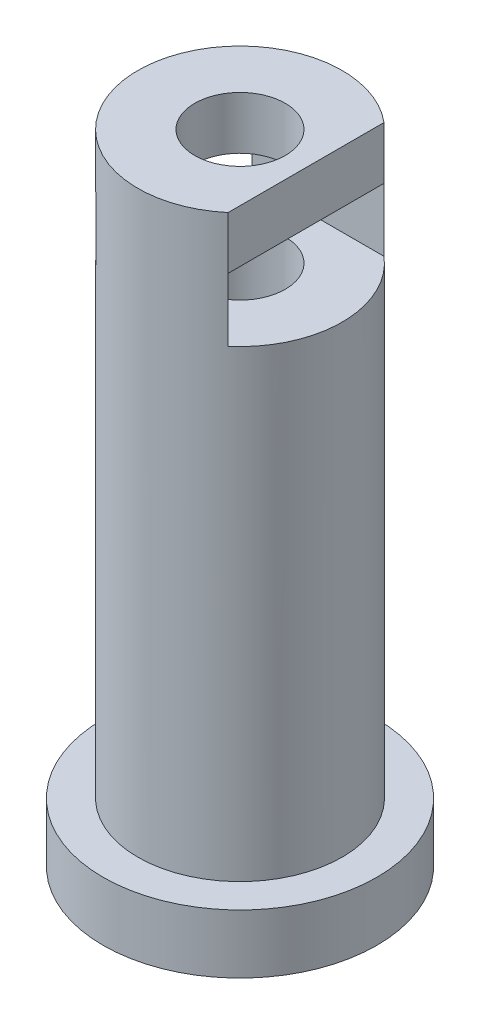
ISO-10303-21;
HEADER;
FILE_DESCRIPTION(('STEP AP214'),'2;1');
FILE_NAME('part.step','',(''),(''),'','','');
FILE_SCHEMA(('AUTOMOTIVE_DESIGN { 1 0 10303 214 1 1 1 1 }'));
ENDSEC;
DATA;
#1=APPLICATION_CONTEXT('core data for automotive mechanical design processes');
#2=APPLICATION_PROTOCOL_DEFINITION('international standard','automotive_design',2000,#1);
#3=PRODUCT_CONTEXT('',#1,'mechanical');
#4=PRODUCT('Part','Part','',(#3));
#5=PRODUCT_RELATED_PRODUCT_CATEGORY('part','',(#4));
#6=PRODUCT_DEFINITION_FORMATION('','',#4);
#7=PRODUCT_DEFINITION_CONTEXT('part definition',#1,'design');
#8=PRODUCT_DEFINITION('design','',#6,#7);
#9=PRODUCT_DEFINITION_SHAPE('','',#8);
#10=(LENGTH_UNIT() NAMED_UNIT(*) SI_UNIT(.MILLI.,.METRE.));
#11=(NAMED_UNIT(*) PLANE_ANGLE_UNIT() SI_UNIT($,.RADIAN.));
#12=(NAMED_UNIT(*) SI_UNIT($,.STERADIAN.) SOLID_ANGLE_UNIT());
#13=UNCERTAINTY_MEASURE_WITH_UNIT(LENGTH_MEASURE(1.E-05),#10,'distance_accuracy_value','');
#14=(GEOMETRIC_REPRESENTATION_CONTEXT(3) GLOBAL_UNCERTAINTY_ASSIGNED_CONTEXT((#13)) GLOBAL_UNIT_ASSIGNED_CONTEXT((#10,
#11,#12)) REPRESENTATION_CONTEXT('',''));
#15=CARTESIAN_POINT('',(0.,0.,0.));
#16=DIRECTION('',(0.,0.,1.));
#17=DIRECTION('',(1.,0.,0.));
#18=AXIS2_PLACEMENT_3D('',#15,#16,#17);
#19=CARTESIAN_POINT('',(0.,27.5,0.));
#20=DIRECTION('',(0.,-1.,0.));
#21=DIRECTION('',(0.,0.,-1.));
#22=AXIS2_PLACEMENT_3D('',#19,#20,#21);
#23=CYLINDRICAL_SURFACE('',#22,4.85);
#24=CARTESIAN_POINT('',(0.,22.,0.));
#25=DIRECTION('',(0.,1.,0.));
#26=DIRECTION('',(0.,0.,1.));
#27=AXIS2_PLACEMENT_3D('',#24,#25,#26);
#28=CIRCLE('',#27,4.85);
#29=CARTESIAN_POINT('',(-3.13568174405503,22.,-3.7));
#30=VERTEX_POINT('',#29);
#31=CARTESIAN_POINT('',(-3.13568174405503,22.,3.7));
#32=VERTEX_POINT('',#31);
#33=EDGE_CURVE('E119',#30,#32,#28,.T.);
#34=ORIENTED_EDGE('',*,*,#33,.F.);
#35=DIRECTION('',(0.,-1.,0.));
#36=VECTOR('',#35,1.);
#37=CARTESIAN_POINT('',(-3.13568174405503,27.5,-3.7));
#38=LINE('',#37,#36);
#39=CARTESIAN_POINT('',(-3.13568174405503,25.,-3.7));
#40=VERTEX_POINT('',#39);
#41=EDGE_CURVE('E57',#30,#40,#38,.F.);
#42=ORIENTED_EDGE('',*,*,#41,.T.);
#43=CARTESIAN_POINT('',(0.,25.,0.));
#44=DIRECTION('',(0.,1.,0.));
#45=DIRECTION('',(0.,0.,1.));
#46=AXIS2_PLACEMENT_3D('',#43,#44,#45);
#47=CIRCLE('',#46,4.85);
#48=CARTESIAN_POINT('',(-3.13568174405503,25.,3.7));
#49=VERTEX_POINT('',#48);
#50=EDGE_CURVE('E103',#40,#49,#47,.T.);
#51=ORIENTED_EDGE('',*,*,#50,.T.);
#52=DIRECTION('',(0.,-1.,0.));
#53=VECTOR('',#52,1.);
#54=CARTESIAN_POINT('',(-3.13568174405503,27.5,3.7));
#55=LINE('',#54,#53);
#56=EDGE_CURVE('E116',#49,#32,#55,.T.);
#57=ORIENTED_EDGE('',*,*,#56,.T.);
#58=EDGE_LOOP('',(#34,#42,#51,#57));
#59=FACE_BOUND('',#58,.T.);
#60=CARTESIAN_POINT('',(0.,0.,0.));
#61=DIRECTION('',(0.,1.,0.));
#62=DIRECTION('',(0.,0.,1.));
#63=AXIS2_PLACEMENT_3D('',#60,#61,#62);
#64=CIRCLE('',#63,4.85);
#65=CARTESIAN_POINT('',(0.,0.,4.85));
#66=VERTEX_POINT('',#65);
#67=EDGE_CURVE('E104',#66,#66,#64,.T.);
#68=ORIENTED_EDGE('',*,*,#67,.T.);
#69=EDGE_LOOP('',(#68));
#70=FACE_BOUND('',#69,.T.);
#71=CARTESIAN_POINT('',(0.,27.5,0.));
#72=DIRECTION('',(0.,1.,0.));
#73=DIRECTION('',(0.,0.,1.));
#74=AXIS2_PLACEMENT_3D('',#71,#72,#73);
#75=CIRCLE('',#74,4.85);
#76=CARTESIAN_POINT('',(3.13568174405503,27.5,-3.7));
#77=VERTEX_POINT('',#76);
#78=CARTESIAN_POINT('',(3.13568174405503,27.5,3.7));
#79=VERTEX_POINT('',#78);
#80=EDGE_CURVE('E96',#77,#79,#75,.T.);
#81=ORIENTED_EDGE('',*,*,#80,.F.);
#82=DIRECTION('',(0.,-1.,0.));
#83=VECTOR('',#82,1.);
#84=CARTESIAN_POINT('',(3.13568174405503,37.,-3.7));
#85=LINE('',#84,#83);
#86=CARTESIAN_POINT('',(3.13568174405503,25.,-3.7));
#87=VERTEX_POINT('',#86);
#88=EDGE_CURVE('E88',#77,#87,#85,.T.);
#89=ORIENTED_EDGE('',*,*,#88,.T.);
#90=DIRECTION('',(0.,-1.,0.));
#91=VECTOR('',#90,1.);
#92=CARTESIAN_POINT('',(3.13568174405503,27.5,-3.7));
#93=LINE('',#92,#91);
#94=CARTESIAN_POINT('',(3.13568174405503,22.,-3.7));
#95=VERTEX_POINT('',#94);
#96=EDGE_CURVE('E121',#87,#95,#93,.T.);
#97=ORIENTED_EDGE('',*,*,#96,.T.);
#98=CARTESIAN_POINT('',(3.13568174405503,22.,3.7));
#99=VERTEX_POINT('',#98);
#100=EDGE_CURVE('E43',#99,#95,#28,.T.);
#101=ORIENTED_EDGE('',*,*,#100,.F.);
#102=DIRECTION('',(0.,-1.,0.));
#103=VECTOR('',#102,1.);
#104=CARTESIAN_POINT('',(3.13568174405503,27.5,3.7));
#105=LINE('',#104,#103);
#106=CARTESIAN_POINT('',(3.13568174405503,25.,3.7));
#107=VERTEX_POINT('',#106);
#108=EDGE_CURVE('E98',#99,#107,#105,.F.);
#109=ORIENTED_EDGE('',*,*,#108,.T.);
#110=DIRECTION('',(0.,-1.,0.));
#111=VECTOR('',#110,1.);
#112=CARTESIAN_POINT('',(3.13568174405503,37.,3.7));
#113=LINE('',#112,#111);
#114=EDGE_CURVE('E86',#79,#107,#113,.T.);
#115=ORIENTED_EDGE('',*,*,#114,.F.);
#116=EDGE_LOOP('',(#81,#89,#97,#101,#109,#115));
#117=FACE_BOUND('',#116,.T.);
#118=ADVANCED_FACE('F36',(#59,#70,#117),#23,.T.);
#119=CARTESIAN_POINT('',(0.,27.5,0.));
#120=DIRECTION('',(0.,1.,0.));
#121=DIRECTION('',(0.,0.,1.));
#122=AXIS2_PLACEMENT_3D('',#119,#120,#121);
#123=PLANE('',#122);
#124=DIRECTION('',(0.,0.,1.));
#125=VECTOR('',#124,1.);
#126=CARTESIAN_POINT('',(3.13568174405503,27.5,0.));
#127=LINE('',#126,#125);
#128=EDGE_CURVE('E83',#77,#79,#127,.T.);
#129=ORIENTED_EDGE('',*,*,#128,.F.);
#130=ORIENTED_EDGE('',*,*,#80,.T.);
#131=EDGE_LOOP('',(#129,#130));
#132=FACE_BOUND('',#131,.T.);
#133=CARTESIAN_POINT('',(0.,27.5,0.));
#134=DIRECTION('',(0.,1.,0.));
#135=DIRECTION('',(0.,0.,1.));
#136=AXIS2_PLACEMENT_3D('',#133,#134,#135);
#137=CIRCLE('',#136,2.15);
#138=CARTESIAN_POINT('',(0.,27.5,2.15));
#139=VERTEX_POINT('',#138);
#140=EDGE_CURVE('E92',#139,#139,#137,.T.);
#141=ORIENTED_EDGE('',*,*,#140,.F.);
#142=EDGE_LOOP('',(#141));
#143=FACE_BOUND('',#142,.T.);
#144=ADVANCED_FACE('F101',(#132,#143),#123,.T.);
#145=CARTESIAN_POINT('',(0.,-2.8,0.));
#146=DIRECTION('',(0.,1.,0.));
#147=DIRECTION('',(0.,0.,1.));
#148=AXIS2_PLACEMENT_3D('',#145,#146,#147);
#149=CYLINDRICAL_SURFACE('',#148,6.5);
#150=CARTESIAN_POINT('',(0.,-2.8,0.));
#151=DIRECTION('',(0.,1.,0.));
#152=DIRECTION('',(0.,0.,1.));
#153=AXIS2_PLACEMENT_3D('',#150,#151,#152);
#154=CIRCLE('',#153,6.5);
#155=CARTESIAN_POINT('',(0.,-2.8,6.5));
#156=VERTEX_POINT('',#155);
#157=EDGE_CURVE('E109',#156,#156,#154,.T.);
#158=ORIENTED_EDGE('',*,*,#157,.T.);
#159=EDGE_LOOP('',(#158));
#160=FACE_BOUND('',#159,.T.);
#161=CARTESIAN_POINT('',(0.,0.,0.));
#162=DIRECTION('',(0.,1.,0.));
#163=DIRECTION('',(0.,0.,1.));
#164=AXIS2_PLACEMENT_3D('',#161,#162,#163);
#165=CIRCLE('',#164,6.5);
#166=CARTESIAN_POINT('',(0.,0.,6.5));
#167=VERTEX_POINT('',#166);
#168=EDGE_CURVE('E112',#167,#167,#165,.T.);
#169=ORIENTED_EDGE('',*,*,#168,.F.);
#170=EDGE_LOOP('',(#169));
#171=FACE_BOUND('',#170,.T.);
#172=ADVANCED_FACE('F150',(#160,#171),#149,.T.);
#173=CARTESIAN_POINT('',(0.,-2.8,0.));
#174=DIRECTION('',(0.,1.,0.));
#175=DIRECTION('',(0.,0.,1.));
#176=AXIS2_PLACEMENT_3D('',#173,#174,#175);
#177=PLANE('',#176);
#178=CARTESIAN_POINT('',(0.,-2.8,0.));
#179=DIRECTION('',(0.,1.,0.));
#180=DIRECTION('',(0.,0.,1.));
#181=AXIS2_PLACEMENT_3D('',#178,#179,#180);
#182=CIRCLE('',#181,2.35);
#183=CARTESIAN_POINT('',(0.,-2.8,2.35));
#184=VERTEX_POINT('',#183);
#185=EDGE_CURVE('E205',#184,#184,#182,.T.);
#186=ORIENTED_EDGE('',*,*,#185,.T.);
#187=EDGE_LOOP('',(#186));
#188=FACE_BOUND('',#187,.T.);
#189=ORIENTED_EDGE('',*,*,#157,.F.);
#190=EDGE_LOOP('',(#189));
#191=FACE_BOUND('',#190,.T.);
#192=ADVANCED_FACE('F152',(#188,#191),#177,.F.);
#193=CARTESIAN_POINT('',(0.,0.,0.));
#194=DIRECTION('',(0.,1.,0.));
#195=DIRECTION('',(0.,0.,1.));
#196=AXIS2_PLACEMENT_3D('',#193,#194,#195);
#197=PLANE('',#196);
#198=ORIENTED_EDGE('',*,*,#67,.F.);
#199=EDGE_LOOP('',(#198));
#200=FACE_BOUND('',#199,.T.);
#201=ORIENTED_EDGE('',*,*,#168,.T.);
#202=EDGE_LOOP('',(#201));
#203=FACE_BOUND('',#202,.T.);
#204=ADVANCED_FACE('F148',(#200,#203),#197,.T.);
#205=CARTESIAN_POINT('',(0.,22.,3.7));
#206=DIRECTION('',(0.,0.,1.));
#207=DIRECTION('',(1.,0.,0.));
#208=AXIS2_PLACEMENT_3D('',#205,#206,#207);
#209=PLANE('',#208);
#210=DIRECTION('',(1.,0.,0.));
#211=VECTOR('',#210,1.);
#212=CARTESIAN_POINT('',(0.,25.,3.7));
#213=LINE('',#212,#211);
#214=EDGE_CURVE('E49',#49,#107,#213,.T.);
#215=ORIENTED_EDGE('',*,*,#214,.T.);
#216=ORIENTED_EDGE('',*,*,#108,.F.);
#217=DIRECTION('',(1.,0.,0.));
#218=VECTOR('',#217,1.);
#219=CARTESIAN_POINT('',(0.,22.,3.7));
#220=LINE('',#219,#218);
#221=EDGE_CURVE('E130',#32,#99,#220,.T.);
#222=ORIENTED_EDGE('',*,*,#221,.F.);
#223=ORIENTED_EDGE('',*,*,#56,.F.);
#224=EDGE_LOOP('',(#215,#216,#222,#223));
#225=FACE_BOUND('',#224,.T.);
#226=ADVANCED_FACE('F169',(#225),#209,.F.);
#227=CARTESIAN_POINT('',(0.,22.,-3.7));
#228=DIRECTION('',(0.,0.,-1.));
#229=DIRECTION('',(-1.,0.,0.));
#230=AXIS2_PLACEMENT_3D('',#227,#228,#229);
#231=PLANE('',#230);
#232=DIRECTION('',(-1.,0.,0.));
#233=VECTOR('',#232,1.);
#234=CARTESIAN_POINT('',(0.,25.,-3.7));
#235=LINE('',#234,#233);
#236=EDGE_CURVE('E136',#87,#40,#235,.T.);
#237=ORIENTED_EDGE('',*,*,#236,.T.);
#238=ORIENTED_EDGE('',*,*,#41,.F.);
#239=DIRECTION('',(-1.,0.,0.));
#240=VECTOR('',#239,1.);
#241=CARTESIAN_POINT('',(0.,22.,-3.7));
#242=LINE('',#241,#240);
#243=EDGE_CURVE('E127',#95,#30,#242,.T.);
#244=ORIENTED_EDGE('',*,*,#243,.F.);
#245=ORIENTED_EDGE('',*,*,#96,.F.);
#246=EDGE_LOOP('',(#237,#238,#244,#245));
#247=FACE_BOUND('',#246,.T.);
#248=ADVANCED_FACE('F132',(#247),#231,.F.);
#249=CARTESIAN_POINT('',(0.,22.,0.));
#250=DIRECTION('',(0.,1.,0.));
#251=DIRECTION('',(0.,0.,1.));
#252=AXIS2_PLACEMENT_3D('',#249,#250,#251);
#253=PLANE('',#252);
#254=ORIENTED_EDGE('',*,*,#221,.T.);
#255=ORIENTED_EDGE('',*,*,#100,.T.);
#256=ORIENTED_EDGE('',*,*,#243,.T.);
#257=ORIENTED_EDGE('',*,*,#33,.T.);
#258=EDGE_LOOP('',(#254,#255,#256,#257));
#259=FACE_BOUND('',#258,.T.);
#260=CARTESIAN_POINT('',(0.,22.,0.));
#261=DIRECTION('',(0.,1.,0.));
#262=DIRECTION('',(0.,0.,1.));
#263=AXIS2_PLACEMENT_3D('',#260,#261,#262);
#264=CIRCLE('',#263,2.15);
#265=CARTESIAN_POINT('',(0.,22.,2.15));
#266=VERTEX_POINT('',#265);
#267=EDGE_CURVE('E140',#266,#266,#264,.T.);
#268=ORIENTED_EDGE('',*,*,#267,.F.);
#269=EDGE_LOOP('',(#268));
#270=FACE_BOUND('',#269,.T.);
#271=ADVANCED_FACE('F125',(#259,#270),#253,.T.);
#272=CARTESIAN_POINT('',(0.,25.,0.));
#273=DIRECTION('',(0.,1.,0.));
#274=DIRECTION('',(0.,0.,1.));
#275=AXIS2_PLACEMENT_3D('',#272,#273,#274);
#276=PLANE('',#275);
#277=CARTESIAN_POINT('',(0.,25.,0.));
#278=DIRECTION('',(0.,1.,0.));
#279=DIRECTION('',(0.,0.,1.));
#280=AXIS2_PLACEMENT_3D('',#277,#278,#279);
#281=CIRCLE('',#280,2.15);
#282=CARTESIAN_POINT('',(0.,25.,2.15));
#283=VERTEX_POINT('',#282);
#284=EDGE_CURVE('E213',#283,#283,#281,.T.);
#285=ORIENTED_EDGE('',*,*,#284,.T.);
#286=EDGE_LOOP('',(#285));
#287=FACE_BOUND('',#286,.T.);
#288=ORIENTED_EDGE('',*,*,#236,.F.);
#289=DIRECTION('',(0.,0.,1.));
#290=VECTOR('',#289,1.);
#291=CARTESIAN_POINT('',(3.13568174405503,25.,0.));
#292=LINE('',#291,#290);
#293=EDGE_CURVE('E11',#87,#107,#292,.T.);
#294=ORIENTED_EDGE('',*,*,#293,.T.);
#295=ORIENTED_EDGE('',*,*,#214,.F.);
#296=ORIENTED_EDGE('',*,*,#50,.F.);
#297=EDGE_LOOP('',(#288,#294,#295,#296));
#298=FACE_BOUND('',#297,.T.);
#299=ADVANCED_FACE('F137',(#287,#298),#276,.F.);
#300=CARTESIAN_POINT('',(0.,12.5,0.));
#301=DIRECTION('',(0.,1.,0.));
#302=DIRECTION('',(0.,0.,1.));
#303=AXIS2_PLACEMENT_3D('',#300,#301,#302);
#304=CYLINDRICAL_SURFACE('',#303,2.15);
#305=ORIENTED_EDGE('',*,*,#140,.T.);
#306=EDGE_LOOP('',(#305));
#307=FACE_BOUND('',#306,.T.);
#308=ORIENTED_EDGE('',*,*,#284,.F.);
#309=EDGE_LOOP('',(#308));
#310=FACE_BOUND('',#309,.T.);
#311=ADVANCED_FACE('F180',(#307,#310),#304,.F.);
#312=ORIENTED_EDGE('',*,*,#267,.T.);
#313=EDGE_LOOP('',(#312));
#314=FACE_BOUND('',#313,.T.);
#315=CARTESIAN_POINT('',(0.,12.5,0.));
#316=DIRECTION('',(0.,1.,0.));
#317=DIRECTION('',(0.,0.,1.));
#318=AXIS2_PLACEMENT_3D('',#315,#316,#317);
#319=CIRCLE('',#318,2.15);
#320=CARTESIAN_POINT('',(0.,12.5,2.15));
#321=VERTEX_POINT('',#320);
#322=EDGE_CURVE('E210',#321,#321,#319,.T.);
#323=ORIENTED_EDGE('',*,*,#322,.F.);
#324=EDGE_LOOP('',(#323));
#325=FACE_BOUND('',#324,.T.);
#326=ADVANCED_FACE('F184',(#314,#325),#304,.F.);
#327=CARTESIAN_POINT('',(0.,12.5,0.));
#328=DIRECTION('',(0.,1.,0.));
#329=DIRECTION('',(0.,0.,1.));
#330=AXIS2_PLACEMENT_3D('',#327,#328,#329);
#331=PLANE('',#330);
#332=ORIENTED_EDGE('',*,*,#322,.T.);
#333=EDGE_LOOP('',(#332));
#334=FACE_BOUND('',#333,.T.);
#335=ADVANCED_FACE('F187',(#334),#331,.T.);
#336=CARTESIAN_POINT('',(3.13568174405503,37.,0.));
#337=DIRECTION('',(-1.,0.,0.));
#338=DIRECTION('',(0.,0.,1.));
#339=AXIS2_PLACEMENT_3D('',#336,#337,#338);
#340=PLANE('',#339);
#341=ORIENTED_EDGE('',*,*,#128,.T.);
#342=ORIENTED_EDGE('',*,*,#114,.T.);
#343=ORIENTED_EDGE('',*,*,#293,.F.);
#344=ORIENTED_EDGE('',*,*,#88,.F.);
#345=EDGE_LOOP('',(#341,#342,#343,#344));
#346=FACE_BOUND('',#345,.T.);
#347=ADVANCED_FACE('F85',(#346),#340,.F.);
#348=CARTESIAN_POINT('',(0.,-1.8,0.));
#349=DIRECTION('',(0.,-1.,0.));
#350=DIRECTION('',(0.,0.,-1.));
#351=AXIS2_PLACEMENT_3D('',#348,#349,#350);
#352=CYLINDRICAL_SURFACE('',#351,2.35);
#353=CARTESIAN_POINT('',(0.,-1.8,0.));
#354=DIRECTION('',(0.,1.,0.));
#355=DIRECTION('',(0.,0.,1.));
#356=AXIS2_PLACEMENT_3D('',#353,#354,#355);
#357=CIRCLE('',#356,2.35);
#358=CARTESIAN_POINT('',(0.,-1.8,2.35));
#359=VERTEX_POINT('',#358);
#360=EDGE_CURVE('E99',#359,#359,#357,.T.);
#361=ORIENTED_EDGE('',*,*,#360,.T.);
#362=EDGE_LOOP('',(#361));
#363=FACE_BOUND('',#362,.T.);
#364=ORIENTED_EDGE('',*,*,#185,.F.);
#365=EDGE_LOOP('',(#364));
#366=FACE_BOUND('',#365,.T.);
#367=ADVANCED_FACE('F194',(#363,#366),#352,.F.);
#368=CARTESIAN_POINT('',(0.,-1.8,0.));
#369=DIRECTION('',(0.,1.,0.));
#370=DIRECTION('',(0.,0.,1.));
#371=AXIS2_PLACEMENT_3D('',#368,#369,#370);
#372=PLANE('',#371);
#373=ORIENTED_EDGE('',*,*,#360,.F.);
#374=EDGE_LOOP('',(#373));
#375=FACE_BOUND('',#374,.T.);
#376=ADVANCED_FACE('F197',(#375),#372,.F.);
#377=CLOSED_SHELL('',(#118,#144,#172,#192,#204,#226,#248,#271,#299,#311,#326,#335,#347,#367,#376));
#378=MANIFOLD_SOLID_BREP('B2',#377);
#379=ADVANCED_BREP_SHAPE_REPRESENTATION('',(#18,#378),#14);
#380=SHAPE_DEFINITION_REPRESENTATION(#9,#379);
ENDSEC;
END-ISO-10303-21;
